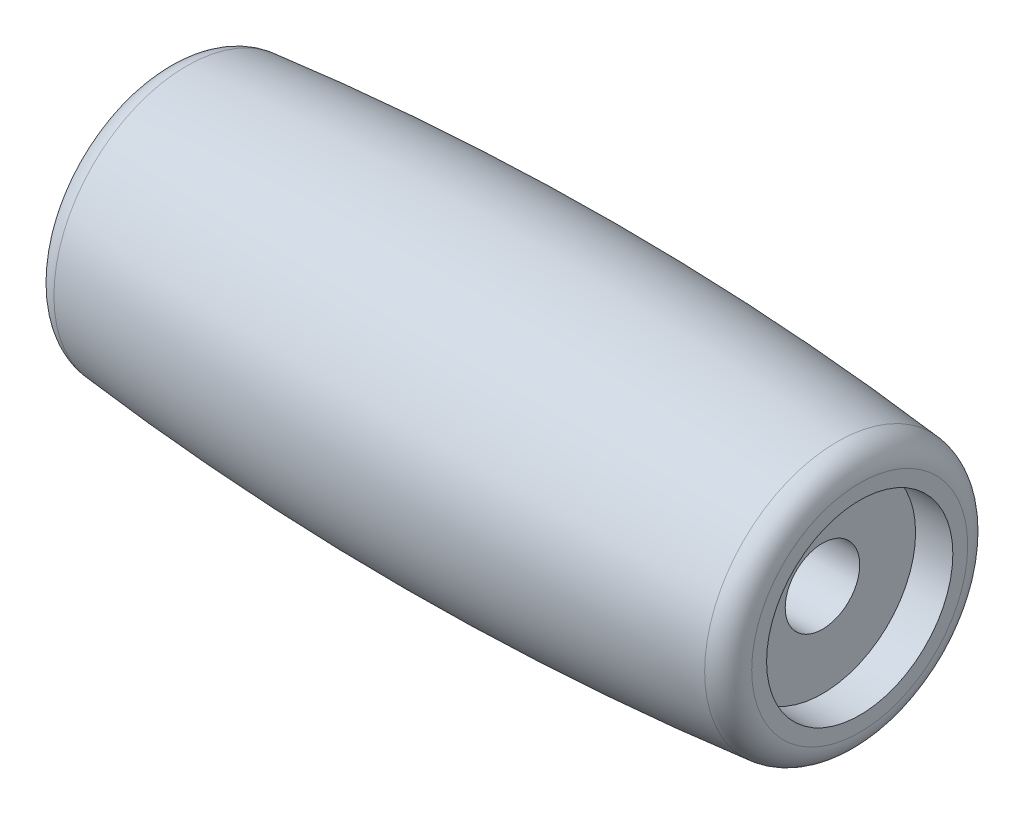
ISO-10303-21;
HEADER;
FILE_DESCRIPTION(('STEP AP214'),'2;1');
FILE_NAME('part.step','',(''),(''),'','','');
FILE_SCHEMA(('AUTOMOTIVE_DESIGN { 1 0 10303 214 1 1 1 1 }'));
ENDSEC;
DATA;
#1=APPLICATION_CONTEXT('core data for automotive mechanical design processes');
#2=APPLICATION_PROTOCOL_DEFINITION('international standard','automotive_design',2000,#1);
#3=PRODUCT_CONTEXT('',#1,'mechanical');
#4=PRODUCT('Part','Part','',(#3));
#5=PRODUCT_RELATED_PRODUCT_CATEGORY('part','',(#4));
#6=PRODUCT_DEFINITION_FORMATION('','',#4);
#7=PRODUCT_DEFINITION_CONTEXT('part definition',#1,'design');
#8=PRODUCT_DEFINITION('design','',#6,#7);
#9=PRODUCT_DEFINITION_SHAPE('','',#8);
#10=(LENGTH_UNIT() NAMED_UNIT(*) SI_UNIT(.MILLI.,.METRE.));
#11=(NAMED_UNIT(*) PLANE_ANGLE_UNIT() SI_UNIT($,.RADIAN.));
#12=(NAMED_UNIT(*) SI_UNIT($,.STERADIAN.) SOLID_ANGLE_UNIT());
#13=UNCERTAINTY_MEASURE_WITH_UNIT(LENGTH_MEASURE(1.E-05),#10,'distance_accuracy_value','');
#14=(GEOMETRIC_REPRESENTATION_CONTEXT(3) GLOBAL_UNCERTAINTY_ASSIGNED_CONTEXT((#13)) GLOBAL_UNIT_ASSIGNED_CONTEXT((#10,
#11,#12)) REPRESENTATION_CONTEXT('',''));
#15=CARTESIAN_POINT('',(0.,0.,0.));
#16=DIRECTION('',(0.,0.,1.));
#17=DIRECTION('',(1.,0.,0.));
#18=AXIS2_PLACEMENT_3D('',#15,#16,#17);
#19=CARTESIAN_POINT('',(12.5,1.5,0.));
#20=DIRECTION('',(-1.,0.,0.));
#21=DIRECTION('',(0.,0.,1.));
#22=AXIS2_PLACEMENT_3D('',#19,#20,#21);
#23=PLANE('',#22);
#24=CARTESIAN_POINT('',(12.5,0.,0.));
#25=DIRECTION('',(-1.,0.,0.));
#26=DIRECTION('',(0.,0.,1.));
#27=AXIS2_PLACEMENT_3D('',#24,#25,#26);
#28=CIRCLE('',#27,3.75);
#29=CARTESIAN_POINT('',(12.5,0.,3.75));
#30=VERTEX_POINT('',#29);
#31=EDGE_CURVE('E48',#30,#30,#28,.T.);
#32=ORIENTED_EDGE('',*,*,#31,.F.);
#33=EDGE_LOOP('',(#32));
#34=FACE_BOUND('',#33,.T.);
#35=CARTESIAN_POINT('',(12.5,0.,0.));
#36=DIRECTION('',(-1.,0.,0.));
#37=DIRECTION('',(0.,0.,1.));
#38=AXIS2_PLACEMENT_3D('',#35,#36,#37);
#39=CIRCLE('',#38,1.5);
#40=CARTESIAN_POINT('',(12.5,0.,1.5));
#41=VERTEX_POINT('',#40);
#42=EDGE_CURVE('E10',#41,#41,#39,.T.);
#43=ORIENTED_EDGE('',*,*,#42,.T.);
#44=EDGE_LOOP('',(#43));
#45=FACE_BOUND('',#44,.T.);
#46=ADVANCED_FACE('F41',(#34,#45),#23,.F.);
#47=CARTESIAN_POINT('',(0.,0.,0.));
#48=DIRECTION('',(-1.,0.,0.));
#49=DIRECTION('',(0.,0.,1.));
#50=AXIS2_PLACEMENT_3D('',#47,#48,#49);
#51=CYLINDRICAL_SURFACE('',#50,3.75);
#52=CARTESIAN_POINT('',(14.,0.,0.));
#53=DIRECTION('',(-1.,0.,0.));
#54=DIRECTION('',(0.,0.,1.));
#55=AXIS2_PLACEMENT_3D('',#52,#53,#54);
#56=CIRCLE('',#55,3.75);
#57=CARTESIAN_POINT('',(14.,0.,3.75));
#58=VERTEX_POINT('',#57);
#59=EDGE_CURVE('E53',#58,#58,#56,.T.);
#60=ORIENTED_EDGE('',*,*,#59,.F.);
#61=EDGE_LOOP('',(#60));
#62=FACE_BOUND('',#61,.T.);
#63=ORIENTED_EDGE('',*,*,#31,.T.);
#64=EDGE_LOOP('',(#63));
#65=FACE_BOUND('',#64,.T.);
#66=ADVANCED_FACE('F130',(#62,#65),#51,.F.);
#67=CARTESIAN_POINT('',(14.,3.75,0.));
#68=DIRECTION('',(-1.,0.,0.));
#69=DIRECTION('',(0.,0.,1.));
#70=AXIS2_PLACEMENT_3D('',#67,#68,#69);
#71=PLANE('',#70);
#72=CARTESIAN_POINT('',(14.,0.,0.));
#73=DIRECTION('',(-1.,0.,0.));
#74=DIRECTION('',(0.,0.,1.));
#75=AXIS2_PLACEMENT_3D('',#72,#73,#74);
#76=CIRCLE('',#75,4.34857666506388);
#77=CARTESIAN_POINT('',(14.,0.,4.34857666506388));
#78=VERTEX_POINT('',#77);
#79=EDGE_CURVE('E58',#78,#78,#76,.T.);
#80=ORIENTED_EDGE('',*,*,#79,.F.);
#81=EDGE_LOOP('',(#80));
#82=FACE_BOUND('',#81,.T.);
#83=ORIENTED_EDGE('',*,*,#59,.T.);
#84=EDGE_LOOP('',(#83));
#85=FACE_BOUND('',#84,.T.);
#86=ADVANCED_FACE('F124',(#82,#85),#71,.F.);
#87=CARTESIAN_POINT('',(13.,0.,0.));
#88=DIRECTION('',(-1.,0.,0.));
#89=DIRECTION('',(0.,0.,1.));
#90=AXIS2_PLACEMENT_3D('',#87,#88,#89);
#91=TOROIDAL_SURFACE('',#90,4.34857666506388,1.00000000000001);
#92=CARTESIAN_POINT('',(13.0999679589875,0.,0.));
#93=DIRECTION('',(-1.,0.,0.));
#94=DIRECTION('',(0.,0.,1.));
#95=AXIS2_PLACEMENT_3D('',#92,#93,#94);
#96=CIRCLE('',#95,5.34356732189234);
#97=CARTESIAN_POINT('',(13.0999679589875,0.,5.34356732189234));
#98=VERTEX_POINT('',#97);
#99=EDGE_CURVE('E64',#98,#98,#96,.T.);
#100=ORIENTED_EDGE('',*,*,#99,.F.);
#101=EDGE_LOOP('',(#100));
#102=FACE_BOUND('',#101,.T.);
#103=ORIENTED_EDGE('',*,*,#79,.T.);
#104=EDGE_LOOP('',(#103));
#105=FACE_BOUND('',#104,.T.);
#106=ADVANCED_FACE('F118',(#102,#105),#91,.T.);
#107=CARTESIAN_POINT('',(0.,0.,0.));
#108=DIRECTION('',(-1.,0.,0.));
#109=DIRECTION('',(0.,0.,1.));
#110=AXIS2_PLACEMENT_3D('',#107,#108,#109);
#111=DEGENERATE_TOROIDAL_SURFACE('',#110,125.041666666667,131.041666666667,.F.);
#112=CARTESIAN_POINT('',(-13.0999679589875,0.,0.));
#113=DIRECTION('',(-1.,0.,0.));
#114=DIRECTION('',(0.,0.,1.));
#115=AXIS2_PLACEMENT_3D('',#112,#113,#114);
#116=CIRCLE('',#115,5.34356732189233);
#117=CARTESIAN_POINT('',(-13.0999679589875,0.,5.34356732189233));
#118=VERTEX_POINT('',#117);
#119=EDGE_CURVE('E68',#118,#118,#116,.T.);
#120=ORIENTED_EDGE('',*,*,#119,.F.);
#121=EDGE_LOOP('',(#120));
#122=FACE_BOUND('',#121,.T.);
#123=ORIENTED_EDGE('',*,*,#99,.T.);
#124=EDGE_LOOP('',(#123));
#125=FACE_BOUND('',#124,.T.);
#126=ADVANCED_FACE('F112',(#122,#125),#111,.F.);
#127=CARTESIAN_POINT('',(-13.,0.,0.));
#128=DIRECTION('',(-1.,0.,0.));
#129=DIRECTION('',(0.,0.,1.));
#130=AXIS2_PLACEMENT_3D('',#127,#128,#129);
#131=TOROIDAL_SURFACE('',#130,4.34857666506388,1.00000000000001);
#132=CARTESIAN_POINT('',(-14.,0.,0.));
#133=DIRECTION('',(-1.,0.,0.));
#134=DIRECTION('',(0.,0.,1.));
#135=AXIS2_PLACEMENT_3D('',#132,#133,#134);
#136=CIRCLE('',#135,4.34857666506388);
#137=CARTESIAN_POINT('',(-14.,0.,4.34857666506388));
#138=VERTEX_POINT('',#137);
#139=EDGE_CURVE('E72',#138,#138,#136,.T.);
#140=ORIENTED_EDGE('',*,*,#139,.F.);
#141=EDGE_LOOP('',(#140));
#142=FACE_BOUND('',#141,.T.);
#143=ORIENTED_EDGE('',*,*,#119,.T.);
#144=EDGE_LOOP('',(#143));
#145=FACE_BOUND('',#144,.T.);
#146=ADVANCED_FACE('F106',(#142,#145),#131,.T.);
#147=CARTESIAN_POINT('',(-14.,3.75,0.));
#148=DIRECTION('',(1.,0.,0.));
#149=DIRECTION('',(0.,0.,-1.));
#150=AXIS2_PLACEMENT_3D('',#147,#148,#149);
#151=PLANE('',#150);
#152=CARTESIAN_POINT('',(-14.,0.,0.));
#153=DIRECTION('',(-1.,0.,0.));
#154=DIRECTION('',(0.,0.,1.));
#155=AXIS2_PLACEMENT_3D('',#152,#153,#154);
#156=CIRCLE('',#155,3.75);
#157=CARTESIAN_POINT('',(-14.,0.,3.75));
#158=VERTEX_POINT('',#157);
#159=EDGE_CURVE('E76',#158,#158,#156,.T.);
#160=ORIENTED_EDGE('',*,*,#159,.F.);
#161=EDGE_LOOP('',(#160));
#162=FACE_BOUND('',#161,.T.);
#163=ORIENTED_EDGE('',*,*,#139,.T.);
#164=EDGE_LOOP('',(#163));
#165=FACE_BOUND('',#164,.T.);
#166=ADVANCED_FACE('F100',(#162,#165),#151,.F.);
#167=CARTESIAN_POINT('',(0.,0.,0.));
#168=DIRECTION('',(-1.,0.,0.));
#169=DIRECTION('',(0.,0.,1.));
#170=AXIS2_PLACEMENT_3D('',#167,#168,#169);
#171=CYLINDRICAL_SURFACE('',#170,3.75);
#172=CARTESIAN_POINT('',(-12.5,0.,0.));
#173=DIRECTION('',(-1.,0.,0.));
#174=DIRECTION('',(0.,0.,1.));
#175=AXIS2_PLACEMENT_3D('',#172,#173,#174);
#176=CIRCLE('',#175,3.75);
#177=CARTESIAN_POINT('',(-12.5,0.,3.75));
#178=VERTEX_POINT('',#177);
#179=EDGE_CURVE('E80',#178,#178,#176,.T.);
#180=ORIENTED_EDGE('',*,*,#179,.F.);
#181=EDGE_LOOP('',(#180));
#182=FACE_BOUND('',#181,.T.);
#183=ORIENTED_EDGE('',*,*,#159,.T.);
#184=EDGE_LOOP('',(#183));
#185=FACE_BOUND('',#184,.T.);
#186=ADVANCED_FACE('F94',(#182,#185),#171,.F.);
#187=CARTESIAN_POINT('',(-12.5,1.5,0.));
#188=DIRECTION('',(1.,0.,0.));
#189=DIRECTION('',(0.,0.,-1.));
#190=AXIS2_PLACEMENT_3D('',#187,#188,#189);
#191=PLANE('',#190);
#192=CARTESIAN_POINT('',(-12.5,0.,0.));
#193=DIRECTION('',(-1.,0.,0.));
#194=DIRECTION('',(0.,0.,1.));
#195=AXIS2_PLACEMENT_3D('',#192,#193,#194);
#196=CIRCLE('',#195,1.5);
#197=CARTESIAN_POINT('',(-12.5,0.,1.5));
#198=VERTEX_POINT('',#197);
#199=EDGE_CURVE('E84',#198,#198,#196,.T.);
#200=ORIENTED_EDGE('',*,*,#199,.F.);
#201=EDGE_LOOP('',(#200));
#202=FACE_BOUND('',#201,.T.);
#203=ORIENTED_EDGE('',*,*,#179,.T.);
#204=EDGE_LOOP('',(#203));
#205=FACE_BOUND('',#204,.T.);
#206=ADVANCED_FACE('F91',(#202,#205),#191,.F.);
#207=CARTESIAN_POINT('',(0.,0.,0.));
#208=DIRECTION('',(-1.,0.,0.));
#209=DIRECTION('',(0.,0.,1.));
#210=AXIS2_PLACEMENT_3D('',#207,#208,#209);
#211=CYLINDRICAL_SURFACE('',#210,1.5);
#212=ORIENTED_EDGE('',*,*,#42,.F.);
#213=EDGE_LOOP('',(#212));
#214=FACE_BOUND('',#213,.T.);
#215=ORIENTED_EDGE('',*,*,#199,.T.);
#216=EDGE_LOOP('',(#215));
#217=FACE_BOUND('',#216,.T.);
#218=ADVANCED_FACE('F89',(#214,#217),#211,.F.);
#219=CLOSED_SHELL('',(#46,#66,#86,#106,#126,#146,#166,#186,#206,#218));
#220=MANIFOLD_SOLID_BREP('B2',#219);
#221=ADVANCED_BREP_SHAPE_REPRESENTATION('',(#18,#220),#14);
#222=SHAPE_DEFINITION_REPRESENTATION(#9,#221);
ENDSEC;
END-ISO-10303-21;
